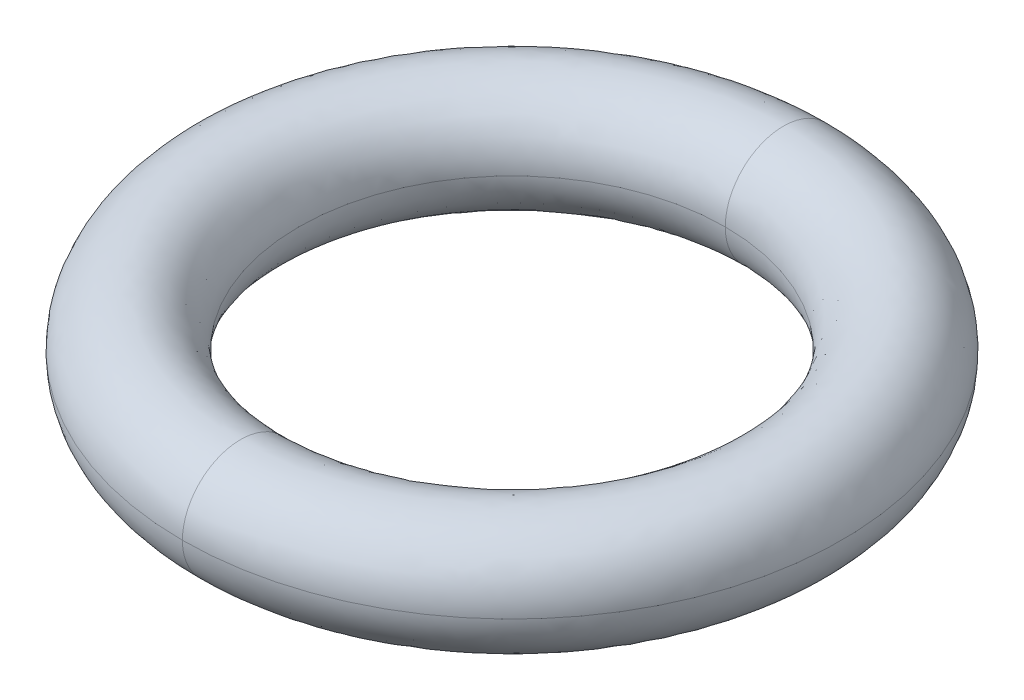
ISO-10303-21;
HEADER;
FILE_DESCRIPTION(('STEP AP214'),'2;1');
FILE_NAME('part.step','',(''),(''),'','','');
FILE_SCHEMA(('AUTOMOTIVE_DESIGN { 1 0 10303 214 1 1 1 1 }'));
ENDSEC;
DATA;
#1=APPLICATION_CONTEXT('core data for automotive mechanical design processes');
#2=APPLICATION_PROTOCOL_DEFINITION('international standard','automotive_design',2000,#1);
#3=PRODUCT_CONTEXT('',#1,'mechanical');
#4=PRODUCT('Part','Part','',(#3));
#5=PRODUCT_RELATED_PRODUCT_CATEGORY('part','',(#4));
#6=PRODUCT_DEFINITION_FORMATION('','',#4);
#7=PRODUCT_DEFINITION_CONTEXT('part definition',#1,'design');
#8=PRODUCT_DEFINITION('design','',#6,#7);
#9=PRODUCT_DEFINITION_SHAPE('','',#8);
#10=(LENGTH_UNIT() NAMED_UNIT(*) SI_UNIT(.MILLI.,.METRE.));
#11=(NAMED_UNIT(*) PLANE_ANGLE_UNIT() SI_UNIT($,.RADIAN.));
#12=(NAMED_UNIT(*) SI_UNIT($,.STERADIAN.) SOLID_ANGLE_UNIT());
#13=UNCERTAINTY_MEASURE_WITH_UNIT(LENGTH_MEASURE(1.E-05),#10,'distance_accuracy_value','');
#14=(GEOMETRIC_REPRESENTATION_CONTEXT(3) GLOBAL_UNCERTAINTY_ASSIGNED_CONTEXT((#13)) GLOBAL_UNIT_ASSIGNED_CONTEXT((#10,
#11,#12)) REPRESENTATION_CONTEXT('',''));
#15=CARTESIAN_POINT('',(0.,0.,0.));
#16=DIRECTION('',(0.,0.,1.));
#17=DIRECTION('',(1.,0.,0.));
#18=AXIS2_PLACEMENT_3D('',#15,#16,#17);
#19=CARTESIAN_POINT('',(0.,-0.074875062,-4.246253124));
#20=CARTESIAN_POINT('',(8.492506248,-0.074875062,-4.246253124));
#21=CARTESIAN_POINT('',(8.492506248,-0.074875062,4.246253124));
#22=CARTESIAN_POINT('',(0.,-0.074875062,4.246253124));
#23=CARTESIAN_POINT('',(0.,0.39775497,-4.293674303));
#24=CARTESIAN_POINT('',(8.587348607,0.39775497,-4.293674303));
#25=CARTESIAN_POINT('',(8.587348607,0.39775497,4.293674303));
#26=CARTESIAN_POINT('',(0.,0.39775497,4.293674303));
#27=CARTESIAN_POINT('',(0.,0.75,-3.97500307));
#28=CARTESIAN_POINT('',(7.950006139,0.75,-3.97500307));
#29=CARTESIAN_POINT('',(7.950006139,0.75,3.97500307));
#30=CARTESIAN_POINT('',(0.,0.75,3.97500307));
#31=CARTESIAN_POINT('',(0.,0.75,-3.5));
#32=CARTESIAN_POINT('',(7.,0.75,-3.5));
#33=CARTESIAN_POINT('',(7.,0.75,3.5));
#34=CARTESIAN_POINT('',(0.,0.75,3.5));
#35=CARTESIAN_POINT('',(0.,0.75,-3.02499693));
#36=CARTESIAN_POINT('',(6.049993861,0.75,-3.02499693));
#37=CARTESIAN_POINT('',(6.049993861,0.75,3.02499693));
#38=CARTESIAN_POINT('',(0.,0.75,3.02499693));
#39=CARTESIAN_POINT('',(0.,0.39775497,-2.706325697));
#40=CARTESIAN_POINT('',(5.412651393,0.39775497,-2.706325697));
#41=CARTESIAN_POINT('',(5.412651393,0.39775497,2.706325697));
#42=CARTESIAN_POINT('',(0.,0.39775497,2.706325697));
#43=CARTESIAN_POINT('',(0.,-0.074875062,-2.753746876));
#44=CARTESIAN_POINT('',(5.507493752,-0.074875062,-2.753746876));
#45=CARTESIAN_POINT('',(5.507493752,-0.074875062,2.753746876));
#46=CARTESIAN_POINT('',(0.,-0.074875062,2.753746876));
#47=(BOUNDED_SURFACE() B_SPLINE_SURFACE(3,3,((#19,#20,#21,#22),(#23,#24,#25,#26),(#27,#28,#29,
#30),(#31,#32,#33,#34),(#35,#36,#37,#38),(#39,#40,#41,#42),(#43,#44,#45,#46)),.UNSPECIFIED.,.F.,
.F.,.F.) B_SPLINE_SURFACE_WITH_KNOTS((4,3,4),(4,4),(0.,0.5,1.),(0.,1.),
.UNSPECIFIED.) GEOMETRIC_REPRESENTATION_ITEM() RATIONAL_B_SPLINE_SURFACE(((1.,0.333333333333333,
0.333333333333333,1.),(0.780588314885163,0.260196104961721,0.260196104961721,0.780588314885163),
(0.780588314885163,0.260196104961721,0.260196104961721,0.780588314885163),(1.,0.333333333333333,
0.333333333333333,1.),(0.780588314885163,0.260196104961721,0.260196104961721,0.780588314885163),
(0.780588314885163,0.260196104961721,0.260196104961721,0.780588314885163),(1.,0.333333333333333,
0.333333333333333,1.))) REPRESENTATION_ITEM('') SURFACE());
#48=CARTESIAN_POINT('',(0.,-1.23797944583644E-09,0.));
#49=DIRECTION('',(0.,1.,0.));
#50=DIRECTION('',(-1.,0.,0.));
#51=AXIS2_PLACEMENT_3D('',#48,#49,#50);
#52=CIRCLE('',#51,2.75000000000527);
#53=CARTESIAN_POINT('',(0.,3.09494694473678E-10,2.75000000000527));
#54=VERTEX_POINT('',#53);
#55=CARTESIAN_POINT('',(0.,3.09494694473678E-10,-2.75000000000527));
#56=VERTEX_POINT('',#55);
#57=EDGE_CURVE('E48',#54,#56,#52,.T.);
#58=CARTESIAN_POINT('',(0.,-0.074875062,4.246253124));
#59=CARTESIAN_POINT('',(0.,0.39775497,4.293674303));
#60=CARTESIAN_POINT('',(0.,0.75,3.97500307));
#61=CARTESIAN_POINT('',(0.,0.75,3.5));
#62=CARTESIAN_POINT('',(0.,0.75,3.02499693));
#63=CARTESIAN_POINT('',(0.,0.39775497,2.706325697));
#64=CARTESIAN_POINT('',(0.,-0.074875062,2.753746876));
#65=(BOUNDED_CURVE() B_SPLINE_CURVE(3,(#58,#59,#60,#61,#62,#63,#64),.UNSPECIFIED.,.F.,
.F.) B_SPLINE_CURVE_WITH_KNOTS((4,3,4),(0.,0.5,1.),
.UNSPECIFIED.) CURVE() GEOMETRIC_REPRESENTATION_ITEM() RATIONAL_B_SPLINE_CURVE((1.,
0.780588314885163,0.780588314885163,1.,0.780588314885163,0.780588314885163,1.)) REPRESENTATION_ITEM(''));
#66=CARTESIAN_POINT('',(0.,3.09494993447264E-10,4.24999999999473));
#67=VERTEX_POINT('',#66);
#68=EDGE_CURVE('E51',#67,#54,#65,.T.);
#69=CARTESIAN_POINT('',(0.,-1.23797909269088E-09,0.));
#70=DIRECTION('',(0.,-1.,0.));
#71=DIRECTION('',(1.,0.,0.));
#72=AXIS2_PLACEMENT_3D('',#69,#70,#71);
#73=CIRCLE('',#72,4.24999999999473);
#74=CARTESIAN_POINT('',(0.,6.18989810763178E-10,-4.24999999999473));
#75=VERTEX_POINT('',#74);
#76=EDGE_CURVE('E22',#75,#67,#73,.T.);
#77=CARTESIAN_POINT('',(0.,-0.074875062,-4.246253124));
#78=CARTESIAN_POINT('',(0.,0.39775497,-4.293674303));
#79=CARTESIAN_POINT('',(0.,0.75,-3.97500307));
#80=CARTESIAN_POINT('',(0.,0.75,-3.5));
#81=CARTESIAN_POINT('',(0.,0.75,-3.02499693));
#82=CARTESIAN_POINT('',(0.,0.39775497,-2.706325697));
#83=CARTESIAN_POINT('',(0.,-0.074875062,-2.753746876));
#84=(BOUNDED_CURVE() B_SPLINE_CURVE(3,(#77,#78,#79,#80,#81,#82,#83),.UNSPECIFIED.,.F.,
.F.) B_SPLINE_CURVE_WITH_KNOTS((4,3,4),(0.,0.5,1.),
.UNSPECIFIED.) CURVE() GEOMETRIC_REPRESENTATION_ITEM() RATIONAL_B_SPLINE_CURVE((1.,
0.780588314885163,0.780588314885163,1.,0.780588314885163,0.780588314885163,1.)) REPRESENTATION_ITEM(''));
#85=EDGE_CURVE('E42',#56,#75,#84,.F.);
#86=ORIENTED_EDGE('',*,*,#57,.F.);
#87=ORIENTED_EDGE('',*,*,#68,.F.);
#88=ORIENTED_EDGE('',*,*,#76,.F.);
#89=ORIENTED_EDGE('',*,*,#85,.F.);
#90=EDGE_LOOP('',(#86,#87,#88,#89));
#91=FACE_BOUND('',#90,.T.);
#92=ADVANCED_FACE('F17',(#91),#47,.T.);
#93=CARTESIAN_POINT('',(0.,0.074875062,-2.753746876));
#94=CARTESIAN_POINT('',(5.507493752,0.074875062,-2.753746876));
#95=CARTESIAN_POINT('',(5.507493752,0.074875062,2.753746876));
#96=CARTESIAN_POINT('',(0.,0.074875062,2.753746876));
#97=CARTESIAN_POINT('',(0.,-0.39775497,-2.706325697));
#98=CARTESIAN_POINT('',(5.412651393,-0.39775497,-2.706325697));
#99=CARTESIAN_POINT('',(5.412651393,-0.39775497,2.706325697));
#100=CARTESIAN_POINT('',(0.,-0.39775497,2.706325697));
#101=CARTESIAN_POINT('',(0.,-0.75,-3.02499693));
#102=CARTESIAN_POINT('',(6.049993861,-0.75,-3.02499693));
#103=CARTESIAN_POINT('',(6.049993861,-0.75,3.02499693));
#104=CARTESIAN_POINT('',(0.,-0.75,3.02499693));
#105=CARTESIAN_POINT('',(0.,-0.75,-3.5));
#106=CARTESIAN_POINT('',(7.,-0.75,-3.5));
#107=CARTESIAN_POINT('',(7.,-0.75,3.5));
#108=CARTESIAN_POINT('',(0.,-0.75,3.5));
#109=CARTESIAN_POINT('',(0.,-0.75,-3.97500307));
#110=CARTESIAN_POINT('',(7.950006139,-0.75,-3.97500307));
#111=CARTESIAN_POINT('',(7.950006139,-0.75,3.97500307));
#112=CARTESIAN_POINT('',(0.,-0.75,3.97500307));
#113=CARTESIAN_POINT('',(0.,-0.39775497,-4.293674303));
#114=CARTESIAN_POINT('',(8.587348607,-0.39775497,-4.293674303));
#115=CARTESIAN_POINT('',(8.587348607,-0.39775497,4.293674303));
#116=CARTESIAN_POINT('',(0.,-0.39775497,4.293674303));
#117=CARTESIAN_POINT('',(0.,0.074875062,-4.246253124));
#118=CARTESIAN_POINT('',(8.492506248,0.074875062,-4.246253124));
#119=CARTESIAN_POINT('',(8.492506248,0.074875062,4.246253124));
#120=CARTESIAN_POINT('',(0.,0.074875062,4.246253124));
#121=(BOUNDED_SURFACE() B_SPLINE_SURFACE(3,3,((#93,#94,#95,#96),(#97,#98,#99,#100),(#101,#102,
#103,#104),(#105,#106,#107,#108),(#109,#110,#111,#112),(#113,#114,#115,#116),(#117,#118,#119,
#120)),.UNSPECIFIED.,.F.,.F.,.F.) B_SPLINE_SURFACE_WITH_KNOTS((4,3,4),(4,4),(0.,0.5,1.),(0.,1.),
.UNSPECIFIED.) GEOMETRIC_REPRESENTATION_ITEM() RATIONAL_B_SPLINE_SURFACE(((1.,0.333333333333333,
0.333333333333333,1.),(0.780588314885163,0.260196104961721,0.260196104961721,0.780588314885163),
(0.780588314885163,0.260196104961721,0.260196104961721,0.780588314885163),(1.,0.333333333333333,
0.333333333333333,1.),(0.780588314885162,0.260196104961721,0.260196104961721,0.780588314885162),
(0.780588314885162,0.260196104961721,0.260196104961721,0.780588314885162),(1.,0.333333333333333,
0.333333333333333,1.))) REPRESENTATION_ITEM('') SURFACE());
#122=CARTESIAN_POINT('',(0.,0.074875062,2.753746876));
#123=CARTESIAN_POINT('',(0.,-0.39775497,2.706325697));
#124=CARTESIAN_POINT('',(0.,-0.75,3.02499693));
#125=CARTESIAN_POINT('',(0.,-0.75,3.5));
#126=CARTESIAN_POINT('',(0.,-0.75,3.97500307));
#127=CARTESIAN_POINT('',(0.,-0.39775497,4.293674303));
#128=CARTESIAN_POINT('',(0.,0.074875062,4.246253124));
#129=(BOUNDED_CURVE() B_SPLINE_CURVE(3,(#122,#123,#124,#125,#126,#127,#128),.UNSPECIFIED.,.F.,
.F.) B_SPLINE_CURVE_WITH_KNOTS((4,3,4),(0.,0.5,1.),
.UNSPECIFIED.) CURVE() GEOMETRIC_REPRESENTATION_ITEM() RATIONAL_B_SPLINE_CURVE((1.,
0.780588314885163,0.780588314885163,1.,0.780588314885162,0.780588314885162,1.)) REPRESENTATION_ITEM(''));
#130=EDGE_CURVE('E62',#54,#67,#129,.T.);
#131=CARTESIAN_POINT('',(0.,0.074875062,-2.753746876));
#132=CARTESIAN_POINT('',(0.,-0.39775497,-2.706325697));
#133=CARTESIAN_POINT('',(0.,-0.75,-3.02499693));
#134=CARTESIAN_POINT('',(0.,-0.75,-3.5));
#135=CARTESIAN_POINT('',(0.,-0.75,-3.97500307));
#136=CARTESIAN_POINT('',(0.,-0.39775497,-4.293674303));
#137=CARTESIAN_POINT('',(0.,0.074875062,-4.246253124));
#138=(BOUNDED_CURVE() B_SPLINE_CURVE(3,(#131,#132,#133,#134,#135,#136,#137),.UNSPECIFIED.,.F.,
.F.) B_SPLINE_CURVE_WITH_KNOTS((4,3,4),(0.,0.5,1.),
.UNSPECIFIED.) CURVE() GEOMETRIC_REPRESENTATION_ITEM() RATIONAL_B_SPLINE_CURVE((1.,
0.780588314885163,0.780588314885163,1.,0.780588314885162,0.780588314885162,1.)) REPRESENTATION_ITEM(''));
#139=EDGE_CURVE('E29',#75,#56,#138,.F.);
#140=ORIENTED_EDGE('',*,*,#130,.F.);
#141=ORIENTED_EDGE('',*,*,#57,.T.);
#142=ORIENTED_EDGE('',*,*,#139,.F.);
#143=ORIENTED_EDGE('',*,*,#76,.T.);
#144=EDGE_LOOP('',(#140,#141,#142,#143));
#145=FACE_BOUND('',#144,.T.);
#146=ADVANCED_FACE('F60',(#145),#121,.T.);
#147=CARTESIAN_POINT('',(0.,-0.074875062,4.246253124));
#148=CARTESIAN_POINT('',(-8.492506248,-0.074875062,4.246253124));
#149=CARTESIAN_POINT('',(-8.492506248,-0.074875062,-4.246253124));
#150=CARTESIAN_POINT('',(0.,-0.074875062,-4.246253124));
#151=CARTESIAN_POINT('',(0.,0.39775497,4.293674303));
#152=CARTESIAN_POINT('',(-8.587348607,0.39775497,4.293674303));
#153=CARTESIAN_POINT('',(-8.587348607,0.39775497,-4.293674303));
#154=CARTESIAN_POINT('',(0.,0.39775497,-4.293674303));
#155=CARTESIAN_POINT('',(0.,0.75,3.97500307));
#156=CARTESIAN_POINT('',(-7.950006139,0.75,3.97500307));
#157=CARTESIAN_POINT('',(-7.950006139,0.75,-3.97500307));
#158=CARTESIAN_POINT('',(0.,0.75,-3.97500307));
#159=CARTESIAN_POINT('',(0.,0.75,3.5));
#160=CARTESIAN_POINT('',(-7.,0.75,3.5));
#161=CARTESIAN_POINT('',(-7.,0.75,-3.5));
#162=CARTESIAN_POINT('',(0.,0.75,-3.5));
#163=CARTESIAN_POINT('',(0.,0.75,3.02499693));
#164=CARTESIAN_POINT('',(-6.049993861,0.75,3.02499693));
#165=CARTESIAN_POINT('',(-6.049993861,0.75,-3.02499693));
#166=CARTESIAN_POINT('',(0.,0.75,-3.02499693));
#167=CARTESIAN_POINT('',(0.,0.39775497,2.706325697));
#168=CARTESIAN_POINT('',(-5.412651393,0.39775497,2.706325697));
#169=CARTESIAN_POINT('',(-5.412651393,0.39775497,-2.706325697));
#170=CARTESIAN_POINT('',(0.,0.39775497,-2.706325697));
#171=CARTESIAN_POINT('',(0.,-0.074875062,2.753746876));
#172=CARTESIAN_POINT('',(-5.507493752,-0.074875062,2.753746876));
#173=CARTESIAN_POINT('',(-5.507493752,-0.074875062,-2.753746876));
#174=CARTESIAN_POINT('',(0.,-0.074875062,-2.753746876));
#175=(BOUNDED_SURFACE() B_SPLINE_SURFACE(3,3,((#147,#148,#149,#150),(#151,#152,#153,#154),(#155,
#156,#157,#158),(#159,#160,#161,#162),(#163,#164,#165,#166),(#167,#168,#169,#170),(#171,#172,
#173,#174)),.UNSPECIFIED.,.F.,.F.,.F.) B_SPLINE_SURFACE_WITH_KNOTS((4,3,4),(4,4),(0.,0.5,1.),
(0.,1.),.UNSPECIFIED.) GEOMETRIC_REPRESENTATION_ITEM() RATIONAL_B_SPLINE_SURFACE(((1.,
0.333333333333333,0.333333333333333,1.),(0.780588314885163,0.260196104961721,0.260196104961721,
0.780588314885163),(0.780588314885163,0.260196104961721,0.260196104961721,0.780588314885163),
(1.,0.333333333333333,0.333333333333333,1.),(0.780588314885163,0.260196104961721,
0.260196104961721,0.780588314885163),(0.780588314885163,0.260196104961721,0.260196104961721,
0.780588314885163),(1.,0.333333333333333,0.333333333333333,1.))) REPRESENTATION_ITEM('') SURFACE());
#176=CARTESIAN_POINT('',(0.,-1.23797944583644E-09,0.));
#177=DIRECTION('',(0.,1.,0.));
#178=DIRECTION('',(-1.,0.,0.));
#179=AXIS2_PLACEMENT_3D('',#176,#177,#178);
#180=CIRCLE('',#179,2.75000000000527);
#181=EDGE_CURVE('E11',#56,#54,#180,.T.);
#182=CARTESIAN_POINT('',(0.,-1.23797909269088E-09,0.));
#183=DIRECTION('',(0.,-1.,0.));
#184=DIRECTION('',(1.,0.,0.));
#185=AXIS2_PLACEMENT_3D('',#182,#183,#184);
#186=CIRCLE('',#185,4.24999999999473);
#187=EDGE_CURVE('E66',#67,#75,#186,.T.);
#188=ORIENTED_EDGE('',*,*,#181,.F.);
#189=ORIENTED_EDGE('',*,*,#85,.T.);
#190=ORIENTED_EDGE('',*,*,#187,.F.);
#191=ORIENTED_EDGE('',*,*,#68,.T.);
#192=EDGE_LOOP('',(#188,#189,#190,#191));
#193=FACE_BOUND('',#192,.T.);
#194=ADVANCED_FACE('F67',(#193),#175,.T.);
#195=CARTESIAN_POINT('',(0.,0.074875062,2.753746876));
#196=CARTESIAN_POINT('',(-5.507493752,0.074875062,2.753746876));
#197=CARTESIAN_POINT('',(-5.507493752,0.074875062,-2.753746876));
#198=CARTESIAN_POINT('',(0.,0.074875062,-2.753746876));
#199=CARTESIAN_POINT('',(0.,-0.39775497,2.706325697));
#200=CARTESIAN_POINT('',(-5.412651393,-0.39775497,2.706325697));
#201=CARTESIAN_POINT('',(-5.412651393,-0.39775497,-2.706325697));
#202=CARTESIAN_POINT('',(0.,-0.39775497,-2.706325697));
#203=CARTESIAN_POINT('',(0.,-0.75,3.02499693));
#204=CARTESIAN_POINT('',(-6.049993861,-0.75,3.02499693));
#205=CARTESIAN_POINT('',(-6.049993861,-0.75,-3.02499693));
#206=CARTESIAN_POINT('',(0.,-0.75,-3.02499693));
#207=CARTESIAN_POINT('',(0.,-0.75,3.5));
#208=CARTESIAN_POINT('',(-7.,-0.75,3.5));
#209=CARTESIAN_POINT('',(-7.,-0.75,-3.5));
#210=CARTESIAN_POINT('',(0.,-0.75,-3.5));
#211=CARTESIAN_POINT('',(0.,-0.75,3.97500307));
#212=CARTESIAN_POINT('',(-7.950006139,-0.75,3.97500307));
#213=CARTESIAN_POINT('',(-7.950006139,-0.75,-3.97500307));
#214=CARTESIAN_POINT('',(0.,-0.75,-3.97500307));
#215=CARTESIAN_POINT('',(0.,-0.39775497,4.293674303));
#216=CARTESIAN_POINT('',(-8.587348607,-0.39775497,4.293674303));
#217=CARTESIAN_POINT('',(-8.587348607,-0.39775497,-4.293674303));
#218=CARTESIAN_POINT('',(0.,-0.39775497,-4.293674303));
#219=CARTESIAN_POINT('',(0.,0.074875062,4.246253124));
#220=CARTESIAN_POINT('',(-8.492506248,0.074875062,4.246253124));
#221=CARTESIAN_POINT('',(-8.492506248,0.074875062,-4.246253124));
#222=CARTESIAN_POINT('',(0.,0.074875062,-4.246253124));
#223=(BOUNDED_SURFACE() B_SPLINE_SURFACE(3,3,((#195,#196,#197,#198),(#199,#200,#201,#202),(#203,
#204,#205,#206),(#207,#208,#209,#210),(#211,#212,#213,#214),(#215,#216,#217,#218),(#219,#220,
#221,#222)),.UNSPECIFIED.,.F.,.F.,.F.) B_SPLINE_SURFACE_WITH_KNOTS((4,3,4),(4,4),(0.,0.5,1.),
(0.,1.),.UNSPECIFIED.) GEOMETRIC_REPRESENTATION_ITEM() RATIONAL_B_SPLINE_SURFACE(((1.,
0.333333333333333,0.333333333333333,1.),(0.780588314885163,0.260196104961721,0.260196104961721,
0.780588314885163),(0.780588314885163,0.260196104961721,0.260196104961721,0.780588314885163),
(1.,0.333333333333333,0.333333333333333,1.),(0.780588314885162,0.260196104961721,
0.260196104961721,0.780588314885162),(0.780588314885162,0.260196104961721,0.260196104961721,
0.780588314885162),(1.,0.333333333333333,0.333333333333333,1.))) REPRESENTATION_ITEM('') SURFACE());
#224=ORIENTED_EDGE('',*,*,#139,.T.);
#225=ORIENTED_EDGE('',*,*,#181,.T.);
#226=ORIENTED_EDGE('',*,*,#130,.T.);
#227=ORIENTED_EDGE('',*,*,#187,.T.);
#228=EDGE_LOOP('',(#224,#225,#226,#227));
#229=FACE_BOUND('',#228,.T.);
#230=ADVANCED_FACE('F71',(#229),#223,.T.);
#231=CLOSED_SHELL('',(#92,#146,#194,#230));
#232=MANIFOLD_SOLID_BREP('B1',#231);
#233=ADVANCED_BREP_SHAPE_REPRESENTATION('',(#18,#232),#14);
#234=SHAPE_DEFINITION_REPRESENTATION(#9,#233);
ENDSEC;
END-ISO-10303-21;
